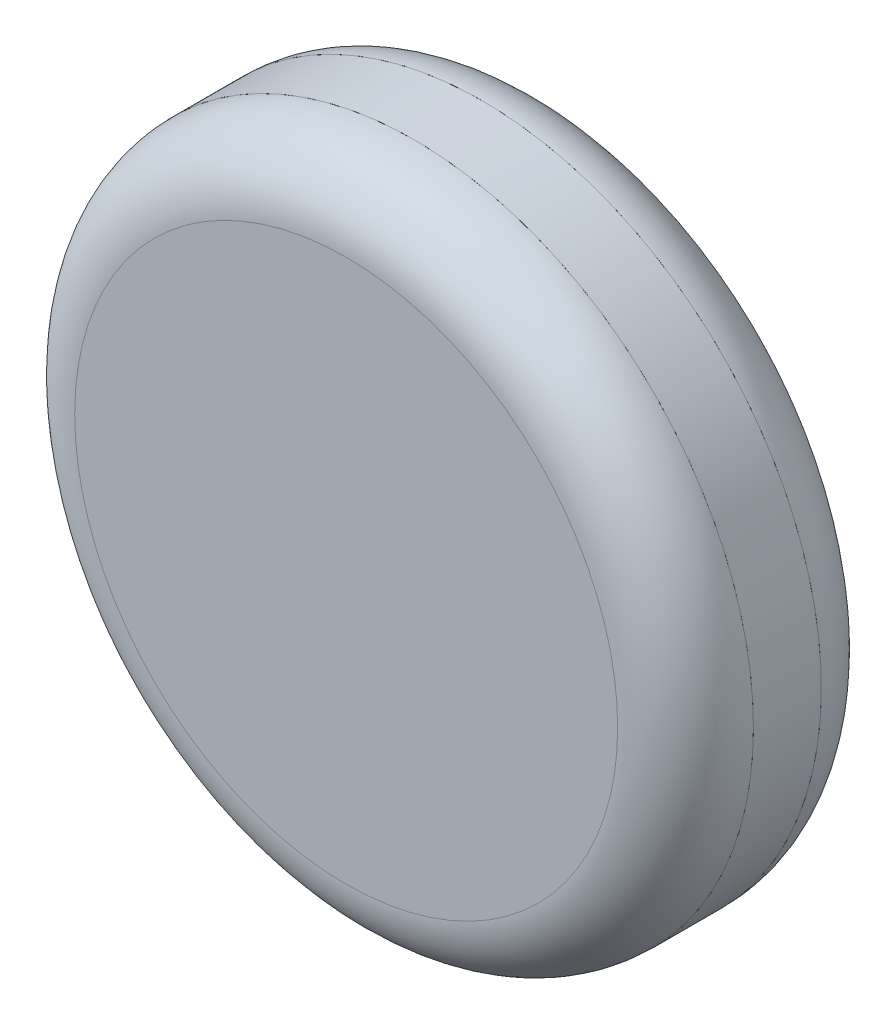
ISO-10303-21;
HEADER;
FILE_DESCRIPTION(('STEP AP214'),'2;1');
FILE_NAME('part.step','',(''),(''),'','','');
FILE_SCHEMA(('AUTOMOTIVE_DESIGN { 1 0 10303 214 1 1 1 1 }'));
ENDSEC;
DATA;
#1=APPLICATION_CONTEXT('core data for automotive mechanical design processes');
#2=APPLICATION_PROTOCOL_DEFINITION('international standard','automotive_design',2000,#1);
#3=PRODUCT_CONTEXT('',#1,'mechanical');
#4=PRODUCT('Part','Part','',(#3));
#5=PRODUCT_RELATED_PRODUCT_CATEGORY('part','',(#4));
#6=PRODUCT_DEFINITION_FORMATION('','',#4);
#7=PRODUCT_DEFINITION_CONTEXT('part definition',#1,'design');
#8=PRODUCT_DEFINITION('design','',#6,#7);
#9=PRODUCT_DEFINITION_SHAPE('','',#8);
#10=(LENGTH_UNIT() NAMED_UNIT(*) SI_UNIT(.MILLI.,.METRE.));
#11=(NAMED_UNIT(*) PLANE_ANGLE_UNIT() SI_UNIT($,.RADIAN.));
#12=(NAMED_UNIT(*) SI_UNIT($,.STERADIAN.) SOLID_ANGLE_UNIT());
#13=UNCERTAINTY_MEASURE_WITH_UNIT(LENGTH_MEASURE(1.E-05),#10,'distance_accuracy_value','');
#14=(GEOMETRIC_REPRESENTATION_CONTEXT(3) GLOBAL_UNCERTAINTY_ASSIGNED_CONTEXT((#13)) GLOBAL_UNIT_ASSIGNED_CONTEXT((#10,
#11,#12)) REPRESENTATION_CONTEXT('',''));
#15=CARTESIAN_POINT('',(0.,0.,0.));
#16=DIRECTION('',(0.,0.,1.));
#17=DIRECTION('',(1.,0.,0.));
#18=AXIS2_PLACEMENT_3D('',#15,#16,#17);
#19=CARTESIAN_POINT('',(0.,0.,-2.));
#20=DIRECTION('',(0.,0.,-1.));
#21=DIRECTION('',(-1.,0.,0.));
#22=AXIS2_PLACEMENT_3D('',#19,#20,#21);
#23=PLANE('',#22);
#24=CARTESIAN_POINT('',(0.,0.,-2.));
#25=DIRECTION('',(0.,0.,-1.));
#26=DIRECTION('',(-1.,0.,0.));
#27=AXIS2_PLACEMENT_3D('',#24,#25,#26);
#28=CIRCLE('',#27,8.);
#29=CARTESIAN_POINT('',(-8.,0.,-2.));
#30=VERTEX_POINT('',#29);
#31=EDGE_CURVE('E11',#30,#30,#28,.T.);
#32=ORIENTED_EDGE('',*,*,#31,.T.);
#33=EDGE_LOOP('',(#32));
#34=FACE_BOUND('',#33,.T.);
#35=ADVANCED_FACE('F48',(#34),#23,.T.);
#36=CARTESIAN_POINT('',(0.,0.,0.));
#37=DIRECTION('',(0.,0.,-1.));
#38=DIRECTION('',(-1.,0.,0.));
#39=AXIS2_PLACEMENT_3D('',#36,#37,#38);
#40=PLANE('',#39);
#41=CARTESIAN_POINT('',(0.,0.,0.));
#42=DIRECTION('',(0.,0.,-1.));
#43=DIRECTION('',(-1.,0.,0.));
#44=AXIS2_PLACEMENT_3D('',#41,#42,#43);
#45=CIRCLE('',#44,10.);
#46=CARTESIAN_POINT('',(-10.,0.,0.));
#47=VERTEX_POINT('',#46);
#48=EDGE_CURVE('E56',#47,#47,#45,.T.);
#49=ORIENTED_EDGE('',*,*,#48,.F.);
#50=EDGE_LOOP('',(#49));
#51=FACE_BOUND('',#50,.T.);
#52=ADVANCED_FACE('F65',(#51),#40,.F.);
#53=CARTESIAN_POINT('',(0.,0.,0.));
#54=DIRECTION('',(0.,0.,-1.));
#55=DIRECTION('',(-1.,0.,0.));
#56=AXIS2_PLACEMENT_3D('',#53,#54,#55);
#57=TOROIDAL_SURFACE('',#56,8.,2.);
#58=ORIENTED_EDGE('',*,*,#48,.T.);
#59=EDGE_LOOP('',(#58));
#60=FACE_BOUND('',#59,.T.);
#61=ORIENTED_EDGE('',*,*,#31,.F.);
#62=EDGE_LOOP('',(#61));
#63=FACE_BOUND('',#62,.T.);
#64=ADVANCED_FACE('F50',(#60,#63),#57,.T.);
#65=CLOSED_SHELL('',(#35,#52,#64));
#66=MANIFOLD_SOLID_BREP('B2',#65);
#67=CARTESIAN_POINT('',(0.,0.,4.));
#68=DIRECTION('',(0.,0.,1.));
#69=DIRECTION('',(1.,0.,0.));
#70=AXIS2_PLACEMENT_3D('',#67,#68,#69);
#71=PLANE('',#70);
#72=CARTESIAN_POINT('',(0.,0.,4.));
#73=DIRECTION('',(0.,0.,1.));
#74=DIRECTION('',(1.,0.,0.));
#75=AXIS2_PLACEMENT_3D('',#72,#73,#74);
#76=CIRCLE('',#75,8.);
#77=CARTESIAN_POINT('',(8.,0.,4.));
#78=VERTEX_POINT('',#77);
#79=EDGE_CURVE('E47',#78,#78,#76,.T.);
#80=ORIENTED_EDGE('',*,*,#79,.T.);
#81=EDGE_LOOP('',(#80));
#82=FACE_BOUND('',#81,.T.);
#83=ADVANCED_FACE('F100',(#82),#71,.T.);
#84=CARTESIAN_POINT('',(0.,0.,2.));
#85=DIRECTION('',(0.,0.,1.));
#86=DIRECTION('',(1.,0.,0.));
#87=AXIS2_PLACEMENT_3D('',#84,#85,#86);
#88=PLANE('',#87);
#89=CARTESIAN_POINT('',(0.,0.,2.));
#90=DIRECTION('',(0.,0.,1.));
#91=DIRECTION('',(1.,0.,0.));
#92=AXIS2_PLACEMENT_3D('',#89,#90,#91);
#93=CIRCLE('',#92,10.);
#94=CARTESIAN_POINT('',(10.,0.,2.));
#95=VERTEX_POINT('',#94);
#96=EDGE_CURVE('E107',#95,#95,#93,.T.);
#97=ORIENTED_EDGE('',*,*,#96,.F.);
#98=EDGE_LOOP('',(#97));
#99=FACE_BOUND('',#98,.T.);
#100=ADVANCED_FACE('F115',(#99),#88,.F.);
#101=CARTESIAN_POINT('',(0.,0.,2.));
#102=DIRECTION('',(0.,0.,1.));
#103=DIRECTION('',(1.,0.,0.));
#104=AXIS2_PLACEMENT_3D('',#101,#102,#103);
#105=TOROIDAL_SURFACE('',#104,8.,2.);
#106=ORIENTED_EDGE('',*,*,#96,.T.);
#107=EDGE_LOOP('',(#106));
#108=FACE_BOUND('',#107,.T.);
#109=ORIENTED_EDGE('',*,*,#79,.F.);
#110=EDGE_LOOP('',(#109));
#111=FACE_BOUND('',#110,.T.);
#112=ADVANCED_FACE('F102',(#108,#111),#105,.T.);
#113=CLOSED_SHELL('',(#83,#100,#112));
#114=MANIFOLD_SOLID_BREP('B6',#113);
#115=CARTESIAN_POINT('',(0.,0.,2.));
#116=DIRECTION('',(0.,0.,-1.));
#117=DIRECTION('',(-1.,0.,0.));
#118=AXIS2_PLACEMENT_3D('',#115,#116,#117);
#119=CYLINDRICAL_SURFACE('',#118,1.5);
#120=CARTESIAN_POINT('',(0.,0.,0.));
#121=DIRECTION('',(0.,0.,1.));
#122=DIRECTION('',(1.,0.,0.));
#123=AXIS2_PLACEMENT_3D('',#120,#121,#122);
#124=CIRCLE('',#123,1.5);
#125=CARTESIAN_POINT('',(1.5,0.,0.));
#126=VERTEX_POINT('',#125);
#127=CARTESIAN_POINT('',(-1.5,0.,0.));
#128=VERTEX_POINT('',#127);
#129=EDGE_CURVE('E204',#126,#128,#124,.T.);
#130=ORIENTED_EDGE('',*,*,#129,.F.);
#131=DIRECTION('',(0.,0.,-1.));
#132=VECTOR('',#131,1.);
#133=CARTESIAN_POINT('',(1.5,0.,2.));
#134=LINE('',#133,#132);
#135=CARTESIAN_POINT('',(1.5,0.,2.));
#136=VERTEX_POINT('',#135);
#137=EDGE_CURVE('E98',#136,#126,#134,.T.);
#138=ORIENTED_EDGE('',*,*,#137,.F.);
#139=CARTESIAN_POINT('',(0.,0.,2.));
#140=DIRECTION('',(0.,0.,1.));
#141=DIRECTION('',(1.,0.,0.));
#142=AXIS2_PLACEMENT_3D('',#139,#140,#141);
#143=CIRCLE('',#142,1.5);
#144=CARTESIAN_POINT('',(-1.5,0.,2.));
#145=VERTEX_POINT('',#144);
#146=EDGE_CURVE('E198',#136,#145,#143,.T.);
#147=ORIENTED_EDGE('',*,*,#146,.T.);
#148=DIRECTION('',(0.,0.,-1.));
#149=VECTOR('',#148,1.);
#150=CARTESIAN_POINT('',(-1.5,0.,2.));
#151=LINE('',#150,#149);
#152=EDGE_CURVE('E179',#145,#128,#151,.T.);
#153=ORIENTED_EDGE('',*,*,#152,.T.);
#154=EDGE_LOOP('',(#130,#138,#147,#153));
#155=FACE_BOUND('',#154,.T.);
#156=ADVANCED_FACE('F141',(#155),#119,.F.);
#157=CARTESIAN_POINT('',(1.5,0.,2.));
#158=DIRECTION('',(-1.,0.,0.));
#159=DIRECTION('',(0.,0.,1.));
#160=AXIS2_PLACEMENT_3D('',#157,#158,#159);
#161=PLANE('',#160);
#162=DIRECTION('',(0.,1.,0.));
#163=VECTOR('',#162,1.);
#164=CARTESIAN_POINT('',(1.5,0.,0.));
#165=LINE('',#164,#163);
#166=CARTESIAN_POINT('',(1.5,-9.88685996664259,0.));
#167=VERTEX_POINT('',#166);
#168=EDGE_CURVE('E192',#167,#126,#165,.T.);
#169=ORIENTED_EDGE('',*,*,#168,.F.);
#170=DIRECTION('',(0.,0.,-1.));
#171=VECTOR('',#170,1.);
#172=CARTESIAN_POINT('',(1.5,-9.88685996664259,2.));
#173=LINE('',#172,#171);
#174=CARTESIAN_POINT('',(1.5,-9.88685996664259,2.));
#175=VERTEX_POINT('',#174);
#176=EDGE_CURVE('E149',#175,#167,#173,.T.);
#177=ORIENTED_EDGE('',*,*,#176,.F.);
#178=DIRECTION('',(0.,1.,0.));
#179=VECTOR('',#178,1.);
#180=CARTESIAN_POINT('',(1.5,0.,2.));
#181=LINE('',#180,#179);
#182=EDGE_CURVE('E190',#175,#136,#181,.T.);
#183=ORIENTED_EDGE('',*,*,#182,.T.);
#184=ORIENTED_EDGE('',*,*,#137,.T.);
#185=EDGE_LOOP('',(#169,#177,#183,#184));
#186=FACE_BOUND('',#185,.T.);
#187=ADVANCED_FACE('F188',(#186),#161,.T.);
#188=CARTESIAN_POINT('',(0.,0.,2.));
#189=DIRECTION('',(0.,0.,-1.));
#190=DIRECTION('',(-1.,0.,0.));
#191=AXIS2_PLACEMENT_3D('',#188,#189,#190);
#192=CYLINDRICAL_SURFACE('',#191,10.);
#193=CARTESIAN_POINT('',(0.,0.,0.));
#194=DIRECTION('',(0.,0.,1.));
#195=DIRECTION('',(1.,0.,0.));
#196=AXIS2_PLACEMENT_3D('',#193,#194,#195);
#197=CIRCLE('',#196,10.);
#198=CARTESIAN_POINT('',(-1.5,-9.88685996664259,0.));
#199=VERTEX_POINT('',#198);
#200=EDGE_CURVE('E172',#167,#199,#197,.T.);
#201=ORIENTED_EDGE('',*,*,#200,.T.);
#202=DIRECTION('',(0.,0.,-1.));
#203=VECTOR('',#202,1.);
#204=CARTESIAN_POINT('',(-1.5,-9.88685996664259,2.));
#205=LINE('',#204,#203);
#206=CARTESIAN_POINT('',(-1.5,-9.88685996664259,2.));
#207=VERTEX_POINT('',#206);
#208=EDGE_CURVE('E193',#207,#199,#205,.T.);
#209=ORIENTED_EDGE('',*,*,#208,.F.);
#210=CARTESIAN_POINT('',(0.,0.,2.));
#211=DIRECTION('',(0.,0.,1.));
#212=DIRECTION('',(1.,0.,0.));
#213=AXIS2_PLACEMENT_3D('',#210,#211,#212);
#214=CIRCLE('',#213,10.);
#215=EDGE_CURVE('E194',#175,#207,#214,.T.);
#216=ORIENTED_EDGE('',*,*,#215,.F.);
#217=ORIENTED_EDGE('',*,*,#176,.T.);
#218=EDGE_LOOP('',(#201,#209,#216,#217));
#219=FACE_BOUND('',#218,.T.);
#220=ADVANCED_FACE('F195',(#219),#192,.T.);
#221=CARTESIAN_POINT('',(-1.5,0.,2.));
#222=DIRECTION('',(-1.,0.,0.));
#223=DIRECTION('',(0.,0.,1.));
#224=AXIS2_PLACEMENT_3D('',#221,#222,#223);
#225=PLANE('',#224);
#226=DIRECTION('',(0.,1.,0.));
#227=VECTOR('',#226,1.);
#228=CARTESIAN_POINT('',(-1.5,0.,0.));
#229=LINE('',#228,#227);
#230=EDGE_CURVE('E200',#199,#128,#229,.T.);
#231=ORIENTED_EDGE('',*,*,#230,.T.);
#232=ORIENTED_EDGE('',*,*,#152,.F.);
#233=DIRECTION('',(0.,1.,0.));
#234=VECTOR('',#233,1.);
#235=CARTESIAN_POINT('',(-1.5,0.,2.));
#236=LINE('',#235,#234);
#237=EDGE_CURVE('E157',#207,#145,#236,.T.);
#238=ORIENTED_EDGE('',*,*,#237,.F.);
#239=ORIENTED_EDGE('',*,*,#208,.T.);
#240=EDGE_LOOP('',(#231,#232,#238,#239));
#241=FACE_BOUND('',#240,.T.);
#242=ADVANCED_FACE('F213',(#241),#225,.F.);
#243=CARTESIAN_POINT('',(0.,0.,2.));
#244=DIRECTION('',(0.,0.,1.));
#245=DIRECTION('',(1.,0.,0.));
#246=AXIS2_PLACEMENT_3D('',#243,#244,#245);
#247=PLANE('',#246);
#248=ORIENTED_EDGE('',*,*,#146,.F.);
#249=ORIENTED_EDGE('',*,*,#182,.F.);
#250=ORIENTED_EDGE('',*,*,#215,.T.);
#251=ORIENTED_EDGE('',*,*,#237,.T.);
#252=EDGE_LOOP('',(#248,#249,#250,#251));
#253=FACE_BOUND('',#252,.T.);
#254=ADVANCED_FACE('F197',(#253),#247,.T.);
#255=CARTESIAN_POINT('',(0.,0.,0.));
#256=DIRECTION('',(0.,0.,1.));
#257=DIRECTION('',(1.,0.,0.));
#258=AXIS2_PLACEMENT_3D('',#255,#256,#257);
#259=PLANE('',#258);
#260=ORIENTED_EDGE('',*,*,#129,.T.);
#261=ORIENTED_EDGE('',*,*,#230,.F.);
#262=ORIENTED_EDGE('',*,*,#200,.F.);
#263=ORIENTED_EDGE('',*,*,#168,.T.);
#264=EDGE_LOOP('',(#260,#261,#262,#263));
#265=FACE_BOUND('',#264,.T.);
#266=ADVANCED_FACE('F215',(#265),#259,.F.);
#267=CLOSED_SHELL('',(#156,#187,#220,#242,#254,#266));
#268=MANIFOLD_SOLID_BREP('B42',#267);
#269=ADVANCED_BREP_SHAPE_REPRESENTATION('',(#18,#66,#114,#268),#14);
#270=SHAPE_DEFINITION_REPRESENTATION(#9,#269);
ENDSEC;
END-ISO-10303-21;
